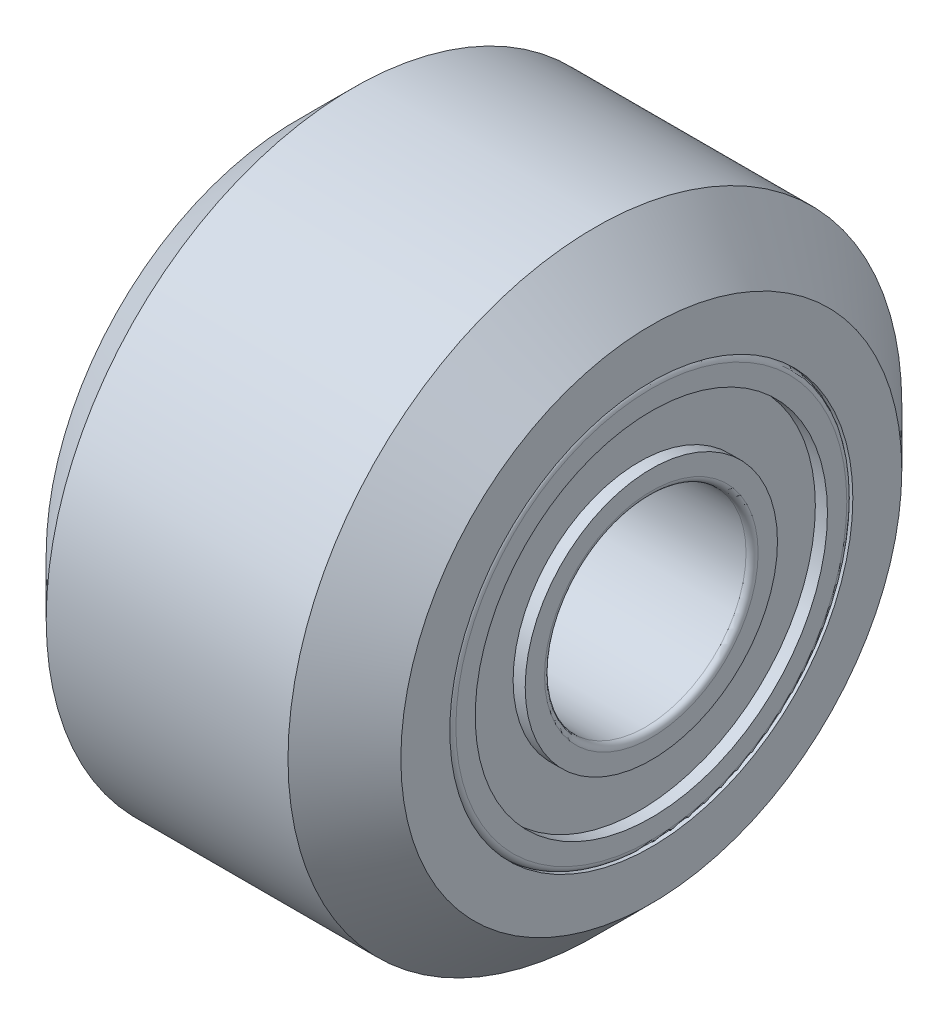
ISO-10303-21;
HEADER;
FILE_DESCRIPTION(('STEP AP214'),'2;1');
FILE_NAME('part.step','',(''),(''),'','','');
FILE_SCHEMA(('AUTOMOTIVE_DESIGN { 1 0 10303 214 1 1 1 1 }'));
ENDSEC;
DATA;
#1=APPLICATION_CONTEXT('core data for automotive mechanical design processes');
#2=APPLICATION_PROTOCOL_DEFINITION('international standard','automotive_design',2000,#1);
#3=PRODUCT_CONTEXT('',#1,'mechanical');
#4=PRODUCT('Part','Part','',(#3));
#5=PRODUCT_RELATED_PRODUCT_CATEGORY('part','',(#4));
#6=PRODUCT_DEFINITION_FORMATION('','',#4);
#7=PRODUCT_DEFINITION_CONTEXT('part definition',#1,'design');
#8=PRODUCT_DEFINITION('design','',#6,#7);
#9=PRODUCT_DEFINITION_SHAPE('','',#8);
#10=(LENGTH_UNIT() NAMED_UNIT(*) SI_UNIT(.MILLI.,.METRE.));
#11=(NAMED_UNIT(*) PLANE_ANGLE_UNIT() SI_UNIT($,.RADIAN.));
#12=(NAMED_UNIT(*) SI_UNIT($,.STERADIAN.) SOLID_ANGLE_UNIT());
#13=UNCERTAINTY_MEASURE_WITH_UNIT(LENGTH_MEASURE(1.E-05),#10,'distance_accuracy_value','');
#14=(GEOMETRIC_REPRESENTATION_CONTEXT(3) GLOBAL_UNCERTAINTY_ASSIGNED_CONTEXT((#13)) GLOBAL_UNIT_ASSIGNED_CONTEXT((#10,
#11,#12)) REPRESENTATION_CONTEXT('',''));
#15=CARTESIAN_POINT('',(0.,0.,0.));
#16=DIRECTION('',(0.,0.,1.));
#17=DIRECTION('',(1.,0.,0.));
#18=AXIS2_PLACEMENT_3D('',#15,#16,#17);
#19=CARTESIAN_POINT('',(3.7,0.,4.37));
#20=DIRECTION('',(1.,0.,0.));
#21=DIRECTION('',(0.,1.,0.));
#22=AXIS2_PLACEMENT_3D('',#19,#20,#21);
#23=PLANE('',#22);
#24=CARTESIAN_POINT('',(3.7,0.,0.));
#25=DIRECTION('',(-1.,0.,0.));
#26=DIRECTION('',(0.,0.,1.));
#27=AXIS2_PLACEMENT_3D('',#24,#25,#26);
#28=CIRCLE('',#27,3.13);
#29=CARTESIAN_POINT('',(3.7,0.,-3.13));
#30=VERTEX_POINT('',#29);
#31=EDGE_CURVE('P0_E28',#30,#30,#28,.T.);
#32=ORIENTED_EDGE('',*,*,#31,.T.);
#33=EDGE_LOOP('',(#32));
#34=FACE_BOUND('',#33,.T.);
#35=CARTESIAN_POINT('',(3.7,0.,0.));
#36=DIRECTION('',(-1.,0.,0.));
#37=DIRECTION('',(0.,0.,1.));
#38=AXIS2_PLACEMENT_3D('',#35,#36,#37);
#39=CIRCLE('',#38,4.37);
#40=CARTESIAN_POINT('',(3.7,0.,-4.37));
#41=VERTEX_POINT('',#40);
#42=EDGE_CURVE('P0_E103',#41,#41,#39,.T.);
#43=ORIENTED_EDGE('',*,*,#42,.F.);
#44=EDGE_LOOP('',(#43));
#45=FACE_BOUND('',#44,.T.);
#46=ADVANCED_FACE('P0_F17',(#34,#45),#23,.T.);
#47=CARTESIAN_POINT('',(3.85,0.,0.));
#48=DIRECTION('',(-1.,0.,0.));
#49=DIRECTION('',(0.,0.,1.));
#50=AXIS2_PLACEMENT_3D('',#47,#48,#49);
#51=CYLINDRICAL_SURFACE('',#50,3.13);
#52=ORIENTED_EDGE('',*,*,#31,.F.);
#53=DIRECTION('',(1.,0.,0.));
#54=VECTOR('',#53,1.);
#55=CARTESIAN_POINT('',(3.85,0.,-3.13));
#56=LINE('',#55,#54);
#57=CARTESIAN_POINT('',(4.,0.,-3.13));
#58=VERTEX_POINT('',#57);
#59=EDGE_CURVE('P0_E11',#30,#58,#56,.T.);
#60=ORIENTED_EDGE('',*,*,#59,.T.);
#61=CARTESIAN_POINT('',(4.,0.,0.));
#62=DIRECTION('',(-1.,0.,0.));
#63=DIRECTION('',(0.,0.,1.));
#64=AXIS2_PLACEMENT_3D('',#61,#62,#63);
#65=CIRCLE('',#64,3.13);
#66=EDGE_CURVE('P0_E173',#58,#58,#65,.T.);
#67=ORIENTED_EDGE('',*,*,#66,.T.);
#68=ORIENTED_EDGE('',*,*,#59,.F.);
#69=EDGE_LOOP('',(#52,#60,#67,#68));
#70=FACE_BOUND('',#69,.T.);
#71=ADVANCED_FACE('P0_F19',(#70),#51,.T.);
#72=CARTESIAN_POINT('',(0.15,0.,0.));
#73=DIRECTION('',(-1.,0.,0.));
#74=DIRECTION('',(0.,0.,1.));
#75=AXIS2_PLACEMENT_3D('',#72,#73,#74);
#76=CYLINDRICAL_SURFACE('',#75,3.13);
#77=CARTESIAN_POINT('',(0.,0.,0.));
#78=DIRECTION('',(-1.,0.,0.));
#79=DIRECTION('',(0.,0.,1.));
#80=AXIS2_PLACEMENT_3D('',#77,#78,#79);
#81=CIRCLE('',#80,3.13);
#82=CARTESIAN_POINT('',(0.,0.,-3.13));
#83=VERTEX_POINT('',#82);
#84=EDGE_CURVE('P0_E95',#83,#83,#81,.T.);
#85=ORIENTED_EDGE('',*,*,#84,.F.);
#86=DIRECTION('',(1.,0.,0.));
#87=VECTOR('',#86,1.);
#88=CARTESIAN_POINT('',(0.15,0.,-3.13));
#89=LINE('',#88,#87);
#90=CARTESIAN_POINT('',(0.3,0.,-3.13));
#91=VERTEX_POINT('',#90);
#92=EDGE_CURVE('P0_E145',#83,#91,#89,.T.);
#93=ORIENTED_EDGE('',*,*,#92,.T.);
#94=CARTESIAN_POINT('',(0.3,0.,0.));
#95=DIRECTION('',(-1.,0.,0.));
#96=DIRECTION('',(0.,0.,1.));
#97=AXIS2_PLACEMENT_3D('',#94,#95,#96);
#98=CIRCLE('',#97,3.13);
#99=EDGE_CURVE('P0_E115',#91,#91,#98,.T.);
#100=ORIENTED_EDGE('',*,*,#99,.T.);
#101=ORIENTED_EDGE('',*,*,#92,.F.);
#102=EDGE_LOOP('',(#85,#93,#100,#101));
#103=FACE_BOUND('',#102,.T.);
#104=ADVANCED_FACE('P0_F403',(#103),#76,.T.);
#105=CARTESIAN_POINT('',(0.3,0.,3.13));
#106=DIRECTION('',(-1.,0.,0.));
#107=DIRECTION('',(0.,0.,1.));
#108=AXIS2_PLACEMENT_3D('',#105,#106,#107);
#109=PLANE('',#108);
#110=ORIENTED_EDGE('',*,*,#99,.F.);
#111=EDGE_LOOP('',(#110));
#112=FACE_BOUND('',#111,.T.);
#113=CARTESIAN_POINT('',(0.3,0.,0.));
#114=DIRECTION('',(-1.,0.,0.));
#115=DIRECTION('',(0.,0.,1.));
#116=AXIS2_PLACEMENT_3D('',#113,#114,#115);
#117=CIRCLE('',#116,4.37);
#118=CARTESIAN_POINT('',(0.3,0.,-4.37));
#119=VERTEX_POINT('',#118);
#120=EDGE_CURVE('P0_E111',#119,#119,#117,.T.);
#121=ORIENTED_EDGE('',*,*,#120,.T.);
#122=EDGE_LOOP('',(#121));
#123=FACE_BOUND('',#122,.T.);
#124=ADVANCED_FACE('P0_F393',(#112,#123),#109,.T.);
#125=CARTESIAN_POINT('',(0.15,0.,0.));
#126=DIRECTION('',(-1.,0.,0.));
#127=DIRECTION('',(0.,0.,1.));
#128=AXIS2_PLACEMENT_3D('',#125,#126,#127);
#129=CYLINDRICAL_SURFACE('',#128,4.37);
#130=CARTESIAN_POINT('',(0.,0.,0.));
#131=DIRECTION('',(-1.,0.,0.));
#132=DIRECTION('',(0.,0.,1.));
#133=AXIS2_PLACEMENT_3D('',#130,#131,#132);
#134=CIRCLE('',#133,4.37);
#135=CARTESIAN_POINT('',(0.,0.,-4.37));
#136=VERTEX_POINT('',#135);
#137=EDGE_CURVE('P0_E105',#136,#136,#134,.T.);
#138=ORIENTED_EDGE('',*,*,#137,.T.);
#139=DIRECTION('',(1.,0.,0.));
#140=VECTOR('',#139,1.);
#141=CARTESIAN_POINT('',(0.15,0.,-4.37));
#142=LINE('',#141,#140);
#143=EDGE_CURVE('P0_E116',#136,#119,#142,.T.);
#144=ORIENTED_EDGE('',*,*,#143,.T.);
#145=ORIENTED_EDGE('',*,*,#120,.F.);
#146=ORIENTED_EDGE('',*,*,#143,.F.);
#147=EDGE_LOOP('',(#138,#144,#145,#146));
#148=FACE_BOUND('',#147,.T.);
#149=ADVANCED_FACE('P0_F382',(#148),#129,.F.);
#150=CARTESIAN_POINT('',(3.85,0.,0.));
#151=DIRECTION('',(-1.,0.,0.));
#152=DIRECTION('',(0.,0.,1.));
#153=AXIS2_PLACEMENT_3D('',#150,#151,#152);
#154=CYLINDRICAL_SURFACE('',#153,4.37);
#155=ORIENTED_EDGE('',*,*,#42,.T.);
#156=DIRECTION('',(1.,0.,0.));
#157=VECTOR('',#156,1.);
#158=CARTESIAN_POINT('',(3.85,0.,-4.37));
#159=LINE('',#158,#157);
#160=CARTESIAN_POINT('',(4.,0.,-4.37));
#161=VERTEX_POINT('',#160);
#162=EDGE_CURVE('P0_E150',#41,#161,#159,.T.);
#163=ORIENTED_EDGE('',*,*,#162,.T.);
#164=CARTESIAN_POINT('',(4.,0.,0.));
#165=DIRECTION('',(-1.,0.,0.));
#166=DIRECTION('',(0.,0.,1.));
#167=AXIS2_PLACEMENT_3D('',#164,#165,#166);
#168=CIRCLE('',#167,4.37);
#169=EDGE_CURVE('P0_E127',#161,#161,#168,.T.);
#170=ORIENTED_EDGE('',*,*,#169,.F.);
#171=ORIENTED_EDGE('',*,*,#162,.F.);
#172=EDGE_LOOP('',(#155,#163,#170,#171));
#173=FACE_BOUND('',#172,.T.);
#174=ADVANCED_FACE('P0_F373',(#173),#154,.F.);
#175=CARTESIAN_POINT('',(0.,0.,2.5));
#176=DIRECTION('',(-1.,0.,0.));
#177=DIRECTION('',(0.,0.,1.));
#178=AXIS2_PLACEMENT_3D('',#175,#176,#177);
#179=PLANE('',#178);
#180=CARTESIAN_POINT('',(0.,0.,0.));
#181=DIRECTION('',(-1.,0.,0.));
#182=DIRECTION('',(0.,0.,-1.));
#183=AXIS2_PLACEMENT_3D('',#180,#181,#182);
#184=CIRCLE('',#183,2.65);
#185=CARTESIAN_POINT('',(0.,0.,-2.65));
#186=VERTEX_POINT('',#185);
#187=EDGE_CURVE('P0_E88',#186,#186,#184,.T.);
#188=ORIENTED_EDGE('',*,*,#187,.F.);
#189=EDGE_LOOP('',(#188));
#190=FACE_BOUND('',#189,.T.);
#191=ORIENTED_EDGE('',*,*,#84,.T.);
#192=EDGE_LOOP('',(#191));
#193=FACE_BOUND('',#192,.T.);
#194=ADVANCED_FACE('P0_F363',(#190,#193),#179,.T.);
#195=CARTESIAN_POINT('',(0.15,0.,0.));
#196=DIRECTION('',(-1.,0.,0.));
#197=DIRECTION('',(0.,0.,1.));
#198=AXIS2_PLACEMENT_3D('',#195,#196,#197);
#199=TOROIDAL_SURFACE('',#198,2.65,0.15);
#200=CARTESIAN_POINT('',(0.15,0.,0.));
#201=DIRECTION('',(1.,0.,0.));
#202=DIRECTION('',(0.,0.,-1.));
#203=AXIS2_PLACEMENT_3D('',#200,#201,#202);
#204=CIRCLE('',#203,2.5);
#205=CARTESIAN_POINT('',(0.15,0.,-2.5));
#206=VERTEX_POINT('',#205);
#207=EDGE_CURVE('P0_E152',#206,#206,#204,.T.);
#208=ORIENTED_EDGE('',*,*,#207,.T.);
#209=CARTESIAN_POINT('',(0.15,0.,-2.65));
#210=DIRECTION('',(0.,-1.,0.));
#211=DIRECTION('',(0.,0.,-1.));
#212=AXIS2_PLACEMENT_3D('',#209,#210,#211);
#213=CIRCLE('',#212,0.15);
#214=EDGE_CURVE('P0_E91',#206,#186,#213,.T.);
#215=ORIENTED_EDGE('',*,*,#214,.T.);
#216=ORIENTED_EDGE('',*,*,#187,.T.);
#217=ORIENTED_EDGE('',*,*,#214,.F.);
#218=EDGE_LOOP('',(#208,#215,#216,#217));
#219=FACE_BOUND('',#218,.T.);
#220=ADVANCED_FACE('P0_F90',(#219),#199,.T.);
#221=CARTESIAN_POINT('',(0.,0.,4.37));
#222=DIRECTION('',(-1.,0.,0.));
#223=DIRECTION('',(0.,0.,1.));
#224=AXIS2_PLACEMENT_3D('',#221,#222,#223);
#225=PLANE('',#224);
#226=ORIENTED_EDGE('',*,*,#137,.F.);
#227=EDGE_LOOP('',(#226));
#228=FACE_BOUND('',#227,.T.);
#229=CARTESIAN_POINT('',(0.,0.,0.));
#230=DIRECTION('',(1.,0.,0.));
#231=DIRECTION('',(0.,0.,-1.));
#232=AXIS2_PLACEMENT_3D('',#229,#230,#231);
#233=CIRCLE('',#232,4.85);
#234=CARTESIAN_POINT('',(0.,0.,-4.85));
#235=VERTEX_POINT('',#234);
#236=EDGE_CURVE('P0_E131',#235,#235,#233,.T.);
#237=ORIENTED_EDGE('',*,*,#236,.F.);
#238=EDGE_LOOP('',(#237));
#239=FACE_BOUND('',#238,.T.);
#240=ADVANCED_FACE('P0_F343',(#228,#239),#225,.T.);
#241=CARTESIAN_POINT('',(0.15,0.,0.));
#242=DIRECTION('',(-1.,0.,0.));
#243=DIRECTION('',(0.,0.,1.));
#244=AXIS2_PLACEMENT_3D('',#241,#242,#243);
#245=TOROIDAL_SURFACE('',#244,4.85,0.15);
#246=ORIENTED_EDGE('',*,*,#236,.T.);
#247=CARTESIAN_POINT('',(0.15,0.,-4.85));
#248=DIRECTION('',(0.,-1.,0.));
#249=DIRECTION('',(0.,0.,-1.));
#250=AXIS2_PLACEMENT_3D('',#247,#248,#249);
#251=CIRCLE('',#250,0.15);
#252=CARTESIAN_POINT('',(0.15,0.,-5.));
#253=VERTEX_POINT('',#252);
#254=EDGE_CURVE('P0_E126',#235,#253,#251,.T.);
#255=ORIENTED_EDGE('',*,*,#254,.T.);
#256=CARTESIAN_POINT('',(0.15,0.,0.));
#257=DIRECTION('',(-1.,0.,0.));
#258=DIRECTION('',(0.,0.,-1.));
#259=AXIS2_PLACEMENT_3D('',#256,#257,#258);
#260=CIRCLE('',#259,5.);
#261=EDGE_CURVE('P0_E136',#253,#253,#260,.T.);
#262=ORIENTED_EDGE('',*,*,#261,.T.);
#263=ORIENTED_EDGE('',*,*,#254,.F.);
#264=EDGE_LOOP('',(#246,#255,#262,#263));
#265=FACE_BOUND('',#264,.T.);
#266=ADVANCED_FACE('P0_F331',(#265),#245,.T.);
#267=CARTESIAN_POINT('',(4.,0.,5.));
#268=DIRECTION('',(1.,0.,0.));
#269=DIRECTION('',(0.,1.,0.));
#270=AXIS2_PLACEMENT_3D('',#267,#268,#269);
#271=PLANE('',#270);
#272=ORIENTED_EDGE('',*,*,#169,.T.);
#273=EDGE_LOOP('',(#272));
#274=FACE_BOUND('',#273,.T.);
#275=CARTESIAN_POINT('',(4.,0.,0.));
#276=DIRECTION('',(-1.,0.,0.));
#277=DIRECTION('',(0.,0.,-1.));
#278=AXIS2_PLACEMENT_3D('',#275,#276,#277);
#279=CIRCLE('',#278,4.85);
#280=CARTESIAN_POINT('',(4.,0.,-4.85));
#281=VERTEX_POINT('',#280);
#282=EDGE_CURVE('P0_E121',#281,#281,#279,.T.);
#283=ORIENTED_EDGE('',*,*,#282,.F.);
#284=EDGE_LOOP('',(#283));
#285=FACE_BOUND('',#284,.T.);
#286=ADVANCED_FACE('P0_F320',(#274,#285),#271,.T.);
#287=CARTESIAN_POINT('',(2.,0.,0.));
#288=DIRECTION('',(-1.,0.,0.));
#289=DIRECTION('',(0.,0.,1.));
#290=AXIS2_PLACEMENT_3D('',#287,#288,#289);
#291=CYLINDRICAL_SURFACE('',#290,5.);
#292=ORIENTED_EDGE('',*,*,#261,.F.);
#293=DIRECTION('',(1.,0.,0.));
#294=VECTOR('',#293,1.);
#295=CARTESIAN_POINT('',(2.,0.,-5.));
#296=LINE('',#295,#294);
#297=CARTESIAN_POINT('',(3.85,0.,-5.));
#298=VERTEX_POINT('',#297);
#299=EDGE_CURVE('P0_E132',#253,#298,#296,.T.);
#300=ORIENTED_EDGE('',*,*,#299,.T.);
#301=CARTESIAN_POINT('',(3.85,0.,0.));
#302=DIRECTION('',(1.,0.,0.));
#303=DIRECTION('',(0.,0.,-1.));
#304=AXIS2_PLACEMENT_3D('',#301,#302,#303);
#305=CIRCLE('',#304,5.);
#306=EDGE_CURVE('P0_E122',#298,#298,#305,.T.);
#307=ORIENTED_EDGE('',*,*,#306,.F.);
#308=ORIENTED_EDGE('',*,*,#299,.F.);
#309=EDGE_LOOP('',(#292,#300,#307,#308));
#310=FACE_BOUND('',#309,.T.);
#311=ADVANCED_FACE('P0_F309',(#310),#291,.T.);
#312=CARTESIAN_POINT('',(3.85,0.,0.));
#313=DIRECTION('',(-1.,0.,0.));
#314=DIRECTION('',(0.,0.,1.));
#315=AXIS2_PLACEMENT_3D('',#312,#313,#314);
#316=TOROIDAL_SURFACE('',#315,4.85,0.15);
#317=ORIENTED_EDGE('',*,*,#306,.T.);
#318=CARTESIAN_POINT('',(3.85,0.,-4.85));
#319=DIRECTION('',(0.,-1.,0.));
#320=DIRECTION('',(0.,0.,-1.));
#321=AXIS2_PLACEMENT_3D('',#318,#319,#320);
#322=CIRCLE('',#321,0.15);
#323=EDGE_CURVE('P0_E117',#298,#281,#322,.T.);
#324=ORIENTED_EDGE('',*,*,#323,.T.);
#325=ORIENTED_EDGE('',*,*,#282,.T.);
#326=ORIENTED_EDGE('',*,*,#323,.F.);
#327=EDGE_LOOP('',(#317,#324,#325,#326));
#328=FACE_BOUND('',#327,.T.);
#329=ADVANCED_FACE('P0_F297',(#328),#316,.T.);
#330=CARTESIAN_POINT('',(4.,0.,3.13));
#331=DIRECTION('',(1.,0.,0.));
#332=DIRECTION('',(0.,1.,0.));
#333=AXIS2_PLACEMENT_3D('',#330,#331,#332);
#334=PLANE('',#333);
#335=CARTESIAN_POINT('',(4.,0.,0.));
#336=DIRECTION('',(1.,0.,0.));
#337=DIRECTION('',(0.,0.,-1.));
#338=AXIS2_PLACEMENT_3D('',#335,#336,#337);
#339=CIRCLE('',#338,2.65);
#340=CARTESIAN_POINT('',(4.,0.,-2.65));
#341=VERTEX_POINT('',#340);
#342=EDGE_CURVE('P0_E109',#341,#341,#339,.T.);
#343=ORIENTED_EDGE('',*,*,#342,.F.);
#344=EDGE_LOOP('',(#343));
#345=FACE_BOUND('',#344,.T.);
#346=ORIENTED_EDGE('',*,*,#66,.F.);
#347=EDGE_LOOP('',(#346));
#348=FACE_BOUND('',#347,.T.);
#349=ADVANCED_FACE('P0_F287',(#345,#348),#334,.T.);
#350=CARTESIAN_POINT('',(2.,0.,0.));
#351=DIRECTION('',(-1.,0.,0.));
#352=DIRECTION('',(0.,0.,1.));
#353=AXIS2_PLACEMENT_3D('',#350,#351,#352);
#354=CYLINDRICAL_SURFACE('',#353,2.5);
#355=ORIENTED_EDGE('',*,*,#207,.F.);
#356=DIRECTION('',(1.,0.,0.));
#357=VECTOR('',#356,1.);
#358=CARTESIAN_POINT('',(2.,0.,-2.5));
#359=LINE('',#358,#357);
#360=CARTESIAN_POINT('',(3.85,0.,-2.5));
#361=VERTEX_POINT('',#360);
#362=EDGE_CURVE('P0_E155',#206,#361,#359,.T.);
#363=ORIENTED_EDGE('',*,*,#362,.T.);
#364=CARTESIAN_POINT('',(3.85,0.,0.));
#365=DIRECTION('',(-1.,0.,0.));
#366=DIRECTION('',(0.,0.,-1.));
#367=AXIS2_PLACEMENT_3D('',#364,#365,#366);
#368=CIRCLE('',#367,2.5);
#369=EDGE_CURVE('P0_E21',#361,#361,#368,.T.);
#370=ORIENTED_EDGE('',*,*,#369,.F.);
#371=ORIENTED_EDGE('',*,*,#362,.F.);
#372=EDGE_LOOP('',(#355,#363,#370,#371));
#373=FACE_BOUND('',#372,.T.);
#374=ADVANCED_FACE('P0_F187',(#373),#354,.F.);
#375=CARTESIAN_POINT('',(3.85,0.,0.));
#376=DIRECTION('',(-1.,0.,0.));
#377=DIRECTION('',(0.,0.,1.));
#378=AXIS2_PLACEMENT_3D('',#375,#376,#377);
#379=TOROIDAL_SURFACE('',#378,2.65,0.15);
#380=ORIENTED_EDGE('',*,*,#342,.T.);
#381=CARTESIAN_POINT('',(3.85,0.,-2.65));
#382=DIRECTION('',(0.,-1.,0.));
#383=DIRECTION('',(0.,0.,-1.));
#384=AXIS2_PLACEMENT_3D('',#381,#382,#383);
#385=CIRCLE('',#384,0.15);
#386=EDGE_CURVE('P0_E156',#341,#361,#385,.T.);
#387=ORIENTED_EDGE('',*,*,#386,.T.);
#388=ORIENTED_EDGE('',*,*,#369,.T.);
#389=ORIENTED_EDGE('',*,*,#386,.F.);
#390=EDGE_LOOP('',(#380,#387,#388,#389));
#391=FACE_BOUND('',#390,.T.);
#392=ADVANCED_FACE('P0_F190',(#391),#379,.T.);
#393=CLOSED_SHELL('',(#46,#71,#104,#124,#149,#174,#194,#220,#240,#266,#286,#311,#329,#349,#374,#392));
#394=MANIFOLD_SOLID_BREP('P0_B1',#393);
#395=CARTESIAN_POINT('',(8.499999642372,0.,4.37));
#396=DIRECTION('',(1.,0.,0.));
#397=DIRECTION('',(0.,1.,0.));
#398=AXIS2_PLACEMENT_3D('',#395,#396,#397);
#399=PLANE('',#398);
#400=CARTESIAN_POINT('',(8.499999642372,0.,0.));
#401=DIRECTION('',(-1.,0.,0.));
#402=DIRECTION('',(0.,0.,1.));
#403=AXIS2_PLACEMENT_3D('',#400,#401,#402);
#404=CIRCLE('',#403,3.13);
#405=CARTESIAN_POINT('',(8.499999642372,0.,-3.13));
#406=VERTEX_POINT('',#405);
#407=EDGE_CURVE('P1_E28',#406,#406,#404,.T.);
#408=ORIENTED_EDGE('',*,*,#407,.T.);
#409=EDGE_LOOP('',(#408));
#410=FACE_BOUND('',#409,.T.);
#411=CARTESIAN_POINT('',(8.499999642372,0.,0.));
#412=DIRECTION('',(-1.,0.,0.));
#413=DIRECTION('',(0.,0.,1.));
#414=AXIS2_PLACEMENT_3D('',#411,#412,#413);
#415=CIRCLE('',#414,4.37);
#416=CARTESIAN_POINT('',(8.499999642372,0.,-4.37));
#417=VERTEX_POINT('',#416);
#418=EDGE_CURVE('P1_E103',#417,#417,#415,.T.);
#419=ORIENTED_EDGE('',*,*,#418,.F.);
#420=EDGE_LOOP('',(#419));
#421=FACE_BOUND('',#420,.T.);
#422=ADVANCED_FACE('P1_F17',(#410,#421),#399,.T.);
#423=CARTESIAN_POINT('',(8.649999642372,0.,0.));
#424=DIRECTION('',(-1.,0.,0.));
#425=DIRECTION('',(0.,0.,1.));
#426=AXIS2_PLACEMENT_3D('',#423,#424,#425);
#427=CYLINDRICAL_SURFACE('',#426,3.13);
#428=ORIENTED_EDGE('',*,*,#407,.F.);
#429=DIRECTION('',(1.,0.,0.));
#430=VECTOR('',#429,1.);
#431=CARTESIAN_POINT('',(8.649999642372,0.,-3.13));
#432=LINE('',#431,#430);
#433=CARTESIAN_POINT('',(8.799999642372,0.,-3.13));
#434=VERTEX_POINT('',#433);
#435=EDGE_CURVE('P1_E11',#406,#434,#432,.T.);
#436=ORIENTED_EDGE('',*,*,#435,.T.);
#437=CARTESIAN_POINT('',(8.799999642372,0.,0.));
#438=DIRECTION('',(-1.,0.,0.));
#439=DIRECTION('',(0.,0.,1.));
#440=AXIS2_PLACEMENT_3D('',#437,#438,#439);
#441=CIRCLE('',#440,3.13);
#442=EDGE_CURVE('P1_E173',#434,#434,#441,.T.);
#443=ORIENTED_EDGE('',*,*,#442,.T.);
#444=ORIENTED_EDGE('',*,*,#435,.F.);
#445=EDGE_LOOP('',(#428,#436,#443,#444));
#446=FACE_BOUND('',#445,.T.);
#447=ADVANCED_FACE('P1_F19',(#446),#427,.T.);
#448=CARTESIAN_POINT('',(4.949999642372,0.,0.));
#449=DIRECTION('',(-1.,0.,0.));
#450=DIRECTION('',(0.,0.,1.));
#451=AXIS2_PLACEMENT_3D('',#448,#449,#450);
#452=CYLINDRICAL_SURFACE('',#451,3.13);
#453=CARTESIAN_POINT('',(4.799999642372,0.,0.));
#454=DIRECTION('',(-1.,0.,0.));
#455=DIRECTION('',(0.,0.,1.));
#456=AXIS2_PLACEMENT_3D('',#453,#454,#455);
#457=CIRCLE('',#456,3.13);
#458=CARTESIAN_POINT('',(4.799999642372,0.,-3.13));
#459=VERTEX_POINT('',#458);
#460=EDGE_CURVE('P1_E95',#459,#459,#457,.T.);
#461=ORIENTED_EDGE('',*,*,#460,.F.);
#462=DIRECTION('',(1.,0.,0.));
#463=VECTOR('',#462,1.);
#464=CARTESIAN_POINT('',(4.949999642372,0.,-3.13));
#465=LINE('',#464,#463);
#466=CARTESIAN_POINT('',(5.099999642372,0.,-3.13));
#467=VERTEX_POINT('',#466);
#468=EDGE_CURVE('P1_E145',#459,#467,#465,.T.);
#469=ORIENTED_EDGE('',*,*,#468,.T.);
#470=CARTESIAN_POINT('',(5.099999642372,0.,0.));
#471=DIRECTION('',(-1.,0.,0.));
#472=DIRECTION('',(0.,0.,1.));
#473=AXIS2_PLACEMENT_3D('',#470,#471,#472);
#474=CIRCLE('',#473,3.13);
#475=EDGE_CURVE('P1_E115',#467,#467,#474,.T.);
#476=ORIENTED_EDGE('',*,*,#475,.T.);
#477=ORIENTED_EDGE('',*,*,#468,.F.);
#478=EDGE_LOOP('',(#461,#469,#476,#477));
#479=FACE_BOUND('',#478,.T.);
#480=ADVANCED_FACE('P1_F403',(#479),#452,.T.);
#481=CARTESIAN_POINT('',(5.099999642372,0.,3.13));
#482=DIRECTION('',(-1.,0.,0.));
#483=DIRECTION('',(0.,0.,1.));
#484=AXIS2_PLACEMENT_3D('',#481,#482,#483);
#485=PLANE('',#484);
#486=ORIENTED_EDGE('',*,*,#475,.F.);
#487=EDGE_LOOP('',(#486));
#488=FACE_BOUND('',#487,.T.);
#489=CARTESIAN_POINT('',(5.099999642372,0.,0.));
#490=DIRECTION('',(-1.,0.,0.));
#491=DIRECTION('',(0.,0.,1.));
#492=AXIS2_PLACEMENT_3D('',#489,#490,#491);
#493=CIRCLE('',#492,4.37);
#494=CARTESIAN_POINT('',(5.099999642372,0.,-4.37));
#495=VERTEX_POINT('',#494);
#496=EDGE_CURVE('P1_E111',#495,#495,#493,.T.);
#497=ORIENTED_EDGE('',*,*,#496,.T.);
#498=EDGE_LOOP('',(#497));
#499=FACE_BOUND('',#498,.T.);
#500=ADVANCED_FACE('P1_F393',(#488,#499),#485,.T.);
#501=CARTESIAN_POINT('',(4.949999642372,0.,0.));
#502=DIRECTION('',(-1.,0.,0.));
#503=DIRECTION('',(0.,0.,1.));
#504=AXIS2_PLACEMENT_3D('',#501,#502,#503);
#505=CYLINDRICAL_SURFACE('',#504,4.37);
#506=CARTESIAN_POINT('',(4.799999642372,0.,0.));
#507=DIRECTION('',(-1.,0.,0.));
#508=DIRECTION('',(0.,0.,1.));
#509=AXIS2_PLACEMENT_3D('',#506,#507,#508);
#510=CIRCLE('',#509,4.37);
#511=CARTESIAN_POINT('',(4.799999642372,0.,-4.37));
#512=VERTEX_POINT('',#511);
#513=EDGE_CURVE('P1_E105',#512,#512,#510,.T.);
#514=ORIENTED_EDGE('',*,*,#513,.T.);
#515=DIRECTION('',(1.,0.,0.));
#516=VECTOR('',#515,1.);
#517=CARTESIAN_POINT('',(4.949999642372,0.,-4.37));
#518=LINE('',#517,#516);
#519=EDGE_CURVE('P1_E116',#512,#495,#518,.T.);
#520=ORIENTED_EDGE('',*,*,#519,.T.);
#521=ORIENTED_EDGE('',*,*,#496,.F.);
#522=ORIENTED_EDGE('',*,*,#519,.F.);
#523=EDGE_LOOP('',(#514,#520,#521,#522));
#524=FACE_BOUND('',#523,.T.);
#525=ADVANCED_FACE('P1_F382',(#524),#505,.F.);
#526=CARTESIAN_POINT('',(8.649999642372,0.,0.));
#527=DIRECTION('',(-1.,0.,0.));
#528=DIRECTION('',(0.,0.,1.));
#529=AXIS2_PLACEMENT_3D('',#526,#527,#528);
#530=CYLINDRICAL_SURFACE('',#529,4.37);
#531=ORIENTED_EDGE('',*,*,#418,.T.);
#532=DIRECTION('',(1.,0.,0.));
#533=VECTOR('',#532,1.);
#534=CARTESIAN_POINT('',(8.649999642372,0.,-4.37));
#535=LINE('',#534,#533);
#536=CARTESIAN_POINT('',(8.799999642372,0.,-4.37));
#537=VERTEX_POINT('',#536);
#538=EDGE_CURVE('P1_E150',#417,#537,#535,.T.);
#539=ORIENTED_EDGE('',*,*,#538,.T.);
#540=CARTESIAN_POINT('',(8.799999642372,0.,0.));
#541=DIRECTION('',(-1.,0.,0.));
#542=DIRECTION('',(0.,0.,1.));
#543=AXIS2_PLACEMENT_3D('',#540,#541,#542);
#544=CIRCLE('',#543,4.37);
#545=EDGE_CURVE('P1_E127',#537,#537,#544,.T.);
#546=ORIENTED_EDGE('',*,*,#545,.F.);
#547=ORIENTED_EDGE('',*,*,#538,.F.);
#548=EDGE_LOOP('',(#531,#539,#546,#547));
#549=FACE_BOUND('',#548,.T.);
#550=ADVANCED_FACE('P1_F373',(#549),#530,.F.);
#551=CARTESIAN_POINT('',(4.799999642372,0.,2.5));
#552=DIRECTION('',(-1.,0.,0.));
#553=DIRECTION('',(0.,0.,1.));
#554=AXIS2_PLACEMENT_3D('',#551,#552,#553);
#555=PLANE('',#554);
#556=CARTESIAN_POINT('',(4.799999642372,0.,0.));
#557=DIRECTION('',(-1.,0.,0.));
#558=DIRECTION('',(0.,0.,-1.));
#559=AXIS2_PLACEMENT_3D('',#556,#557,#558);
#560=CIRCLE('',#559,2.65);
#561=CARTESIAN_POINT('',(4.799999642372,0.,-2.65));
#562=VERTEX_POINT('',#561);
#563=EDGE_CURVE('P1_E88',#562,#562,#560,.T.);
#564=ORIENTED_EDGE('',*,*,#563,.F.);
#565=EDGE_LOOP('',(#564));
#566=FACE_BOUND('',#565,.T.);
#567=ORIENTED_EDGE('',*,*,#460,.T.);
#568=EDGE_LOOP('',(#567));
#569=FACE_BOUND('',#568,.T.);
#570=ADVANCED_FACE('P1_F363',(#566,#569),#555,.T.);
#571=CARTESIAN_POINT('',(4.949999642372,0.,0.));
#572=DIRECTION('',(-1.,0.,0.));
#573=DIRECTION('',(0.,0.,1.));
#574=AXIS2_PLACEMENT_3D('',#571,#572,#573);
#575=TOROIDAL_SURFACE('',#574,2.65,0.15);
#576=CARTESIAN_POINT('',(4.949999642372,0.,0.));
#577=DIRECTION('',(1.,0.,0.));
#578=DIRECTION('',(0.,0.,-1.));
#579=AXIS2_PLACEMENT_3D('',#576,#577,#578);
#580=CIRCLE('',#579,2.5);
#581=CARTESIAN_POINT('',(4.949999642372,0.,-2.5));
#582=VERTEX_POINT('',#581);
#583=EDGE_CURVE('P1_E152',#582,#582,#580,.T.);
#584=ORIENTED_EDGE('',*,*,#583,.T.);
#585=CARTESIAN_POINT('',(4.949999642372,0.,-2.65));
#586=DIRECTION('',(0.,-1.,0.));
#587=DIRECTION('',(0.,0.,-1.));
#588=AXIS2_PLACEMENT_3D('',#585,#586,#587);
#589=CIRCLE('',#588,0.15);
#590=EDGE_CURVE('P1_E91',#582,#562,#589,.T.);
#591=ORIENTED_EDGE('',*,*,#590,.T.);
#592=ORIENTED_EDGE('',*,*,#563,.T.);
#593=ORIENTED_EDGE('',*,*,#590,.F.);
#594=EDGE_LOOP('',(#584,#591,#592,#593));
#595=FACE_BOUND('',#594,.T.);
#596=ADVANCED_FACE('P1_F90',(#595),#575,.T.);
#597=CARTESIAN_POINT('',(4.799999642372,0.,4.37));
#598=DIRECTION('',(-1.,0.,0.));
#599=DIRECTION('',(0.,0.,1.));
#600=AXIS2_PLACEMENT_3D('',#597,#598,#599);
#601=PLANE('',#600);
#602=ORIENTED_EDGE('',*,*,#513,.F.);
#603=EDGE_LOOP('',(#602));
#604=FACE_BOUND('',#603,.T.);
#605=CARTESIAN_POINT('',(4.799999642372,0.,0.));
#606=DIRECTION('',(1.,0.,0.));
#607=DIRECTION('',(0.,0.,-1.));
#608=AXIS2_PLACEMENT_3D('',#605,#606,#607);
#609=CIRCLE('',#608,4.85);
#610=CARTESIAN_POINT('',(4.799999642372,0.,-4.85));
#611=VERTEX_POINT('',#610);
#612=EDGE_CURVE('P1_E131',#611,#611,#609,.T.);
#613=ORIENTED_EDGE('',*,*,#612,.F.);
#614=EDGE_LOOP('',(#613));
#615=FACE_BOUND('',#614,.T.);
#616=ADVANCED_FACE('P1_F343',(#604,#615),#601,.T.);
#617=CARTESIAN_POINT('',(4.949999642372,0.,0.));
#618=DIRECTION('',(-1.,0.,0.));
#619=DIRECTION('',(0.,0.,1.));
#620=AXIS2_PLACEMENT_3D('',#617,#618,#619);
#621=TOROIDAL_SURFACE('',#620,4.85,0.15);
#622=ORIENTED_EDGE('',*,*,#612,.T.);
#623=CARTESIAN_POINT('',(4.949999642372,0.,-4.85));
#624=DIRECTION('',(0.,-1.,0.));
#625=DIRECTION('',(0.,0.,-1.));
#626=AXIS2_PLACEMENT_3D('',#623,#624,#625);
#627=CIRCLE('',#626,0.15);
#628=CARTESIAN_POINT('',(4.949999642372,0.,-5.));
#629=VERTEX_POINT('',#628);
#630=EDGE_CURVE('P1_E126',#611,#629,#627,.T.);
#631=ORIENTED_EDGE('',*,*,#630,.T.);
#632=CARTESIAN_POINT('',(4.949999642372,0.,0.));
#633=DIRECTION('',(-1.,0.,0.));
#634=DIRECTION('',(0.,0.,-1.));
#635=AXIS2_PLACEMENT_3D('',#632,#633,#634);
#636=CIRCLE('',#635,5.);
#637=EDGE_CURVE('P1_E136',#629,#629,#636,.T.);
#638=ORIENTED_EDGE('',*,*,#637,.T.);
#639=ORIENTED_EDGE('',*,*,#630,.F.);
#640=EDGE_LOOP('',(#622,#631,#638,#639));
#641=FACE_BOUND('',#640,.T.);
#642=ADVANCED_FACE('P1_F331',(#641),#621,.T.);
#643=CARTESIAN_POINT('',(8.799999642372,0.,5.));
#644=DIRECTION('',(1.,0.,0.));
#645=DIRECTION('',(0.,1.,0.));
#646=AXIS2_PLACEMENT_3D('',#643,#644,#645);
#647=PLANE('',#646);
#648=ORIENTED_EDGE('',*,*,#545,.T.);
#649=EDGE_LOOP('',(#648));
#650=FACE_BOUND('',#649,.T.);
#651=CARTESIAN_POINT('',(8.799999642372,0.,0.));
#652=DIRECTION('',(-1.,0.,0.));
#653=DIRECTION('',(0.,0.,-1.));
#654=AXIS2_PLACEMENT_3D('',#651,#652,#653);
#655=CIRCLE('',#654,4.85);
#656=CARTESIAN_POINT('',(8.799999642372,0.,-4.85));
#657=VERTEX_POINT('',#656);
#658=EDGE_CURVE('P1_E121',#657,#657,#655,.T.);
#659=ORIENTED_EDGE('',*,*,#658,.F.);
#660=EDGE_LOOP('',(#659));
#661=FACE_BOUND('',#660,.T.);
#662=ADVANCED_FACE('P1_F320',(#650,#661),#647,.T.);
#663=CARTESIAN_POINT('',(6.799999642372,0.,0.));
#664=DIRECTION('',(-1.,0.,0.));
#665=DIRECTION('',(0.,0.,1.));
#666=AXIS2_PLACEMENT_3D('',#663,#664,#665);
#667=CYLINDRICAL_SURFACE('',#666,5.);
#668=ORIENTED_EDGE('',*,*,#637,.F.);
#669=DIRECTION('',(1.,0.,0.));
#670=VECTOR('',#669,1.);
#671=CARTESIAN_POINT('',(6.799999642372,0.,-5.));
#672=LINE('',#671,#670);
#673=CARTESIAN_POINT('',(8.649999642372,0.,-5.));
#674=VERTEX_POINT('',#673);
#675=EDGE_CURVE('P1_E132',#629,#674,#672,.T.);
#676=ORIENTED_EDGE('',*,*,#675,.T.);
#677=CARTESIAN_POINT('',(8.649999642372,0.,0.));
#678=DIRECTION('',(1.,0.,0.));
#679=DIRECTION('',(0.,0.,-1.));
#680=AXIS2_PLACEMENT_3D('',#677,#678,#679);
#681=CIRCLE('',#680,5.);
#682=EDGE_CURVE('P1_E122',#674,#674,#681,.T.);
#683=ORIENTED_EDGE('',*,*,#682,.F.);
#684=ORIENTED_EDGE('',*,*,#675,.F.);
#685=EDGE_LOOP('',(#668,#676,#683,#684));
#686=FACE_BOUND('',#685,.T.);
#687=ADVANCED_FACE('P1_F309',(#686),#667,.T.);
#688=CARTESIAN_POINT('',(8.649999642372,0.,0.));
#689=DIRECTION('',(-1.,0.,0.));
#690=DIRECTION('',(0.,0.,1.));
#691=AXIS2_PLACEMENT_3D('',#688,#689,#690);
#692=TOROIDAL_SURFACE('',#691,4.85,0.15);
#693=ORIENTED_EDGE('',*,*,#682,.T.);
#694=CARTESIAN_POINT('',(8.649999642372,0.,-4.85));
#695=DIRECTION('',(0.,-1.,0.));
#696=DIRECTION('',(0.,0.,-1.));
#697=AXIS2_PLACEMENT_3D('',#694,#695,#696);
#698=CIRCLE('',#697,0.15);
#699=EDGE_CURVE('P1_E117',#674,#657,#698,.T.);
#700=ORIENTED_EDGE('',*,*,#699,.T.);
#701=ORIENTED_EDGE('',*,*,#658,.T.);
#702=ORIENTED_EDGE('',*,*,#699,.F.);
#703=EDGE_LOOP('',(#693,#700,#701,#702));
#704=FACE_BOUND('',#703,.T.);
#705=ADVANCED_FACE('P1_F297',(#704),#692,.T.);
#706=CARTESIAN_POINT('',(8.799999642372,0.,3.13));
#707=DIRECTION('',(1.,0.,0.));
#708=DIRECTION('',(0.,1.,0.));
#709=AXIS2_PLACEMENT_3D('',#706,#707,#708);
#710=PLANE('',#709);
#711=CARTESIAN_POINT('',(8.799999642372,0.,0.));
#712=DIRECTION('',(1.,0.,0.));
#713=DIRECTION('',(0.,0.,-1.));
#714=AXIS2_PLACEMENT_3D('',#711,#712,#713);
#715=CIRCLE('',#714,2.65);
#716=CARTESIAN_POINT('',(8.799999642372,0.,-2.65));
#717=VERTEX_POINT('',#716);
#718=EDGE_CURVE('P1_E109',#717,#717,#715,.T.);
#719=ORIENTED_EDGE('',*,*,#718,.F.);
#720=EDGE_LOOP('',(#719));
#721=FACE_BOUND('',#720,.T.);
#722=ORIENTED_EDGE('',*,*,#442,.F.);
#723=EDGE_LOOP('',(#722));
#724=FACE_BOUND('',#723,.T.);
#725=ADVANCED_FACE('P1_F287',(#721,#724),#710,.T.);
#726=CARTESIAN_POINT('',(6.799999642372,0.,0.));
#727=DIRECTION('',(-1.,0.,0.));
#728=DIRECTION('',(0.,0.,1.));
#729=AXIS2_PLACEMENT_3D('',#726,#727,#728);
#730=CYLINDRICAL_SURFACE('',#729,2.5);
#731=ORIENTED_EDGE('',*,*,#583,.F.);
#732=DIRECTION('',(1.,0.,0.));
#733=VECTOR('',#732,1.);
#734=CARTESIAN_POINT('',(6.799999642372,0.,-2.5));
#735=LINE('',#734,#733);
#736=CARTESIAN_POINT('',(8.649999642372,0.,-2.5));
#737=VERTEX_POINT('',#736);
#738=EDGE_CURVE('P1_E155',#582,#737,#735,.T.);
#739=ORIENTED_EDGE('',*,*,#738,.T.);
#740=CARTESIAN_POINT('',(8.649999642372,0.,0.));
#741=DIRECTION('',(-1.,0.,0.));
#742=DIRECTION('',(0.,0.,-1.));
#743=AXIS2_PLACEMENT_3D('',#740,#741,#742);
#744=CIRCLE('',#743,2.5);
#745=EDGE_CURVE('P1_E21',#737,#737,#744,.T.);
#746=ORIENTED_EDGE('',*,*,#745,.F.);
#747=ORIENTED_EDGE('',*,*,#738,.F.);
#748=EDGE_LOOP('',(#731,#739,#746,#747));
#749=FACE_BOUND('',#748,.T.);
#750=ADVANCED_FACE('P1_F187',(#749),#730,.F.);
#751=CARTESIAN_POINT('',(8.649999642372,0.,0.));
#752=DIRECTION('',(-1.,0.,0.));
#753=DIRECTION('',(0.,0.,1.));
#754=AXIS2_PLACEMENT_3D('',#751,#752,#753);
#755=TOROIDAL_SURFACE('',#754,2.65,0.15);
#756=ORIENTED_EDGE('',*,*,#718,.T.);
#757=CARTESIAN_POINT('',(8.649999642372,0.,-2.65));
#758=DIRECTION('',(0.,-1.,0.));
#759=DIRECTION('',(0.,0.,-1.));
#760=AXIS2_PLACEMENT_3D('',#757,#758,#759);
#761=CIRCLE('',#760,0.15);
#762=EDGE_CURVE('P1_E156',#717,#737,#761,.T.);
#763=ORIENTED_EDGE('',*,*,#762,.T.);
#764=ORIENTED_EDGE('',*,*,#745,.T.);
#765=ORIENTED_EDGE('',*,*,#762,.F.);
#766=EDGE_LOOP('',(#756,#763,#764,#765));
#767=FACE_BOUND('',#766,.T.);
#768=ADVANCED_FACE('P1_F190',(#767),#755,.T.);
#769=CLOSED_SHELL('',(#422,#447,#480,#500,#525,#550,#570,#596,#616,#642,#662,#687,#705,#725,
#750,#768));
#770=MANIFOLD_SOLID_BREP('P1_B1',#769);
#771=CARTESIAN_POINT('',(4.8,0.,5.));
#772=DIRECTION('',(1.,0.,0.));
#773=DIRECTION('',(0.,1.,0.));
#774=AXIS2_PLACEMENT_3D('',#771,#772,#773);
#775=PLANE('',#774);
#776=CARTESIAN_POINT('',(4.8,0.,0.));
#777=DIRECTION('',(-1.,0.,0.));
#778=DIRECTION('',(0.,0.,1.));
#779=AXIS2_PLACEMENT_3D('',#776,#777,#778);
#780=CIRCLE('',#779,4.25);
#781=CARTESIAN_POINT('',(4.8,0.,-4.25));
#782=VERTEX_POINT('',#781);
#783=EDGE_CURVE('P2_E10',#782,#782,#780,.T.);
#784=ORIENTED_EDGE('',*,*,#783,.T.);
#785=EDGE_LOOP('',(#784));
#786=FACE_BOUND('',#785,.T.);
#787=CARTESIAN_POINT('',(4.8,0.,0.));
#788=DIRECTION('',(-1.,0.,0.));
#789=DIRECTION('',(0.,0.,1.));
#790=AXIS2_PLACEMENT_3D('',#787,#788,#789);
#791=CIRCLE('',#790,5.);
#792=CARTESIAN_POINT('',(4.8,0.,-5.));
#793=VERTEX_POINT('',#792);
#794=EDGE_CURVE('P2_E107',#793,#793,#791,.T.);
#795=ORIENTED_EDGE('',*,*,#794,.F.);
#796=EDGE_LOOP('',(#795));
#797=FACE_BOUND('',#796,.T.);
#798=ADVANCED_FACE('P2_F16',(#786,#797),#775,.T.);
#799=CARTESIAN_POINT('',(4.4,0.,0.));
#800=DIRECTION('',(-1.,0.,0.));
#801=DIRECTION('',(0.,0.,1.));
#802=AXIS2_PLACEMENT_3D('',#799,#800,#801);
#803=CYLINDRICAL_SURFACE('',#802,4.25);
#804=CARTESIAN_POINT('',(4.,0.,0.));
#805=DIRECTION('',(-1.,0.,0.));
#806=DIRECTION('',(0.,0.,1.));
#807=AXIS2_PLACEMENT_3D('',#804,#805,#806);
#808=CIRCLE('',#807,4.25);
#809=CARTESIAN_POINT('',(4.,0.,-4.25));
#810=VERTEX_POINT('',#809);
#811=EDGE_CURVE('P2_E142',#810,#810,#808,.T.);
#812=ORIENTED_EDGE('',*,*,#811,.T.);
#813=DIRECTION('',(1.,0.,0.));
#814=VECTOR('',#813,1.);
#815=CARTESIAN_POINT('',(4.4,0.,-4.25));
#816=LINE('',#815,#814);
#817=EDGE_CURVE('P2_E26',#810,#782,#816,.T.);
#818=ORIENTED_EDGE('',*,*,#817,.T.);
#819=ORIENTED_EDGE('',*,*,#783,.F.);
#820=ORIENTED_EDGE('',*,*,#817,.F.);
#821=EDGE_LOOP('',(#812,#818,#819,#820));
#822=FACE_BOUND('',#821,.T.);
#823=ADVANCED_FACE('P2_F192',(#822),#803,.F.);
#824=CARTESIAN_POINT('',(4.,0.,4.25));
#825=DIRECTION('',(-1.,0.,0.));
#826=DIRECTION('',(0.,0.,1.));
#827=AXIS2_PLACEMENT_3D('',#824,#825,#826);
#828=PLANE('',#827);
#829=ORIENTED_EDGE('',*,*,#811,.F.);
#830=EDGE_LOOP('',(#829));
#831=FACE_BOUND('',#830,.T.);
#832=CARTESIAN_POINT('',(4.,0.,0.));
#833=DIRECTION('',(-1.,0.,0.));
#834=DIRECTION('',(0.,0.,1.));
#835=AXIS2_PLACEMENT_3D('',#832,#833,#834);
#836=CIRCLE('',#835,5.);
#837=CARTESIAN_POINT('',(4.,0.,-5.));
#838=VERTEX_POINT('',#837);
#839=EDGE_CURVE('P2_E117',#838,#838,#836,.T.);
#840=ORIENTED_EDGE('',*,*,#839,.T.);
#841=EDGE_LOOP('',(#840));
#842=FACE_BOUND('',#841,.T.);
#843=ADVANCED_FACE('P2_F18',(#831,#842),#828,.T.);
#844=CARTESIAN_POINT('',(2.,0.,0.));
#845=DIRECTION('',(-1.,0.,0.));
#846=DIRECTION('',(0.,0.,1.));
#847=AXIS2_PLACEMENT_3D('',#844,#845,#846);
#848=CYLINDRICAL_SURFACE('',#847,5.);
#849=CARTESIAN_POINT('',(0.,0.,0.));
#850=DIRECTION('',(-1.,0.,0.));
#851=DIRECTION('',(0.,0.,1.));
#852=AXIS2_PLACEMENT_3D('',#849,#850,#851);
#853=CIRCLE('',#852,5.);
#854=CARTESIAN_POINT('',(0.,0.,-5.));
#855=VERTEX_POINT('',#854);
#856=EDGE_CURVE('P2_E119',#855,#855,#853,.T.);
#857=ORIENTED_EDGE('',*,*,#856,.T.);
#858=DIRECTION('',(1.,0.,0.));
#859=VECTOR('',#858,1.);
#860=CARTESIAN_POINT('',(2.,0.,-5.));
#861=LINE('',#860,#859);
#862=EDGE_CURVE('P2_E98',#855,#838,#861,.T.);
#863=ORIENTED_EDGE('',*,*,#862,.T.);
#864=ORIENTED_EDGE('',*,*,#839,.F.);
#865=ORIENTED_EDGE('',*,*,#862,.F.);
#866=EDGE_LOOP('',(#857,#863,#864,#865));
#867=FACE_BOUND('',#866,.T.);
#868=ADVANCED_FACE('P2_F189',(#867),#848,.F.);
#869=CARTESIAN_POINT('',(6.8,0.,0.));
#870=DIRECTION('',(-1.,0.,0.));
#871=DIRECTION('',(0.,0.,1.));
#872=AXIS2_PLACEMENT_3D('',#869,#870,#871);
#873=CYLINDRICAL_SURFACE('',#872,5.);
#874=ORIENTED_EDGE('',*,*,#794,.T.);
#875=DIRECTION('',(1.,0.,0.));
#876=VECTOR('',#875,1.);
#877=CARTESIAN_POINT('',(6.8,0.,-5.));
#878=LINE('',#877,#876);
#879=CARTESIAN_POINT('',(8.8,0.,-5.));
#880=VERTEX_POINT('',#879);
#881=EDGE_CURVE('P2_E104',#793,#880,#878,.T.);
#882=ORIENTED_EDGE('',*,*,#881,.T.);
#883=CARTESIAN_POINT('',(8.8,0.,0.));
#884=DIRECTION('',(-1.,0.,0.));
#885=DIRECTION('',(0.,0.,1.));
#886=AXIS2_PLACEMENT_3D('',#883,#884,#885);
#887=CIRCLE('',#886,5.);
#888=EDGE_CURVE('P2_E109',#880,#880,#887,.T.);
#889=ORIENTED_EDGE('',*,*,#888,.F.);
#890=ORIENTED_EDGE('',*,*,#881,.F.);
#891=EDGE_LOOP('',(#874,#882,#889,#890));
#892=FACE_BOUND('',#891,.T.);
#893=ADVANCED_FACE('P2_F105',(#892),#873,.F.);
#894=CARTESIAN_POINT('',(0.,0.,5.));
#895=DIRECTION('',(-1.,0.,0.));
#896=DIRECTION('',(0.,0.,1.));
#897=AXIS2_PLACEMENT_3D('',#894,#895,#896);
#898=PLANE('',#897);
#899=ORIENTED_EDGE('',*,*,#856,.F.);
#900=EDGE_LOOP('',(#899));
#901=FACE_BOUND('',#900,.T.);
#902=CARTESIAN_POINT('',(0.,0.,0.));
#903=DIRECTION('',(1.,0.,0.));
#904=DIRECTION('',(0.,0.,-1.));
#905=AXIS2_PLACEMENT_3D('',#902,#903,#904);
#906=CIRCLE('',#905,6.215);
#907=CARTESIAN_POINT('',(0.,0.,6.215));
#908=VERTEX_POINT('',#907);
#909=EDGE_CURVE('P2_E123',#908,#908,#906,.T.);
#910=ORIENTED_EDGE('',*,*,#909,.F.);
#911=EDGE_LOOP('',(#910));
#912=FACE_BOUND('',#911,.T.);
#913=ADVANCED_FACE('P2_F177',(#901,#912),#898,.T.);
#914=CARTESIAN_POINT('',(0.7,0.,0.));
#915=DIRECTION('',(1.,0.,0.));
#916=DIRECTION('',(0.,0.,-1.));
#917=AXIS2_PLACEMENT_3D('',#914,#915,#916);
#918=CONICAL_SURFACE('',#917,6.915,0.785398163397448);
#919=ORIENTED_EDGE('',*,*,#909,.T.);
#920=DIRECTION('',(0.707106781186547,0.,0.707106781186548));
#921=VECTOR('',#920,1.);
#922=CARTESIAN_POINT('',(0.7,0.,6.915));
#923=LINE('',#922,#921);
#924=CARTESIAN_POINT('',(1.4,0.,7.615));
#925=VERTEX_POINT('',#924);
#926=EDGE_CURVE('P2_E20',#908,#925,#923,.T.);
#927=ORIENTED_EDGE('',*,*,#926,.T.);
#928=CARTESIAN_POINT('',(1.4,0.,0.));
#929=DIRECTION('',(-1.,0.,0.));
#930=DIRECTION('',(0.,0.,-1.));
#931=AXIS2_PLACEMENT_3D('',#928,#929,#930);
#932=CIRCLE('',#931,7.615);
#933=CARTESIAN_POINT('',(1.4,0.,-7.615));
#934=VERTEX_POINT('',#933);
#935=EDGE_CURVE('P2_E137',#925,#934,#932,.T.);
#936=ORIENTED_EDGE('',*,*,#935,.T.);
#937=CARTESIAN_POINT('',(1.4,0.,0.));
#938=DIRECTION('',(-1.,0.,0.));
#939=DIRECTION('',(0.,0.,-1.));
#940=AXIS2_PLACEMENT_3D('',#937,#938,#939);
#941=CIRCLE('',#940,7.615);
#942=EDGE_CURVE('P2_E144',#934,#925,#941,.T.);
#943=ORIENTED_EDGE('',*,*,#942,.T.);
#944=ORIENTED_EDGE('',*,*,#926,.F.);
#945=EDGE_LOOP('',(#919,#927,#936,#943,#944));
#946=FACE_BOUND('',#945,.T.);
#947=ADVANCED_FACE('P2_F175',(#946),#918,.T.);
#948=CARTESIAN_POINT('',(8.8,0.,7.615));
#949=DIRECTION('',(1.,0.,0.));
#950=DIRECTION('',(0.,1.,0.));
#951=AXIS2_PLACEMENT_3D('',#948,#949,#950);
#952=PLANE('',#951);
#953=ORIENTED_EDGE('',*,*,#888,.T.);
#954=EDGE_LOOP('',(#953));
#955=FACE_BOUND('',#954,.T.);
#956=CARTESIAN_POINT('',(8.8,0.,0.));
#957=DIRECTION('',(-1.,0.,0.));
#958=DIRECTION('',(0.,0.,-1.));
#959=AXIS2_PLACEMENT_3D('',#956,#957,#958);
#960=CIRCLE('',#959,6.215);
#961=CARTESIAN_POINT('',(8.8,0.,6.215));
#962=VERTEX_POINT('',#961);
#963=EDGE_CURVE('P2_E132',#962,#962,#960,.T.);
#964=ORIENTED_EDGE('',*,*,#963,.F.);
#965=EDGE_LOOP('',(#964));
#966=FACE_BOUND('',#965,.T.);
#967=ADVANCED_FACE('P2_F187',(#955,#966),#952,.T.);
#968=CARTESIAN_POINT('',(4.4,0.,0.));
#969=DIRECTION('',(-1.,0.,0.));
#970=DIRECTION('',(0.,0.,1.));
#971=AXIS2_PLACEMENT_3D('',#968,#969,#970);
#972=CYLINDRICAL_SURFACE('',#971,7.615);
#973=ORIENTED_EDGE('',*,*,#935,.F.);
#974=ORIENTED_EDGE('',*,*,#942,.F.);
#975=DIRECTION('',(1.,0.,0.));
#976=VECTOR('',#975,1.);
#977=CARTESIAN_POINT('',(4.4,0.,-7.615));
#978=LINE('',#977,#976);
#979=CARTESIAN_POINT('',(7.4,0.,-7.615));
#980=VERTEX_POINT('',#979);
#981=EDGE_CURVE('P2_E87',#934,#980,#978,.T.);
#982=ORIENTED_EDGE('',*,*,#981,.T.);
#983=CARTESIAN_POINT('',(7.4,0.,0.));
#984=DIRECTION('',(1.,0.,0.));
#985=DIRECTION('',(0.,0.,-1.));
#986=AXIS2_PLACEMENT_3D('',#983,#984,#985);
#987=CIRCLE('',#986,7.615);
#988=CARTESIAN_POINT('',(7.4,0.,7.615));
#989=VERTEX_POINT('',#988);
#990=EDGE_CURVE('P2_E125',#989,#980,#987,.T.);
#991=ORIENTED_EDGE('',*,*,#990,.F.);
#992=CARTESIAN_POINT('',(7.4,0.,0.));
#993=DIRECTION('',(1.,0.,0.));
#994=DIRECTION('',(0.,0.,-1.));
#995=AXIS2_PLACEMENT_3D('',#992,#993,#994);
#996=CIRCLE('',#995,7.615);
#997=EDGE_CURVE('P2_E127',#980,#989,#996,.T.);
#998=ORIENTED_EDGE('',*,*,#997,.F.);
#999=ORIENTED_EDGE('',*,*,#981,.F.);
#1000=EDGE_LOOP('',(#973,#974,#982,#991,#998,#999));
#1001=FACE_BOUND('',#1000,.T.);
#1002=ADVANCED_FACE('P2_F201',(#1001),#972,.T.);
#1003=CARTESIAN_POINT('',(8.1,0.,0.));
#1004=DIRECTION('',(-1.,0.,0.));
#1005=DIRECTION('',(0.,0.,-1.));
#1006=AXIS2_PLACEMENT_3D('',#1003,#1004,#1005);
#1007=CONICAL_SURFACE('',#1006,6.915,0.785398163397448);
#1008=ORIENTED_EDGE('',*,*,#990,.T.);
#1009=ORIENTED_EDGE('',*,*,#997,.T.);
#1010=DIRECTION('',(0.707106781186548,0.,-0.707106781186547));
#1011=VECTOR('',#1010,1.);
#1012=CARTESIAN_POINT('',(8.1,0.,6.915));
#1013=LINE('',#1012,#1011);
#1014=EDGE_CURVE('P2_E76',#989,#962,#1013,.T.);
#1015=ORIENTED_EDGE('',*,*,#1014,.T.);
#1016=ORIENTED_EDGE('',*,*,#963,.T.);
#1017=ORIENTED_EDGE('',*,*,#1014,.F.);
#1018=EDGE_LOOP('',(#1008,#1009,#1015,#1016,#1017));
#1019=FACE_BOUND('',#1018,.T.);
#1020=ADVANCED_FACE('P2_F270',(#1019),#1007,.T.);
#1021=CLOSED_SHELL('',(#798,#823,#843,#868,#893,#913,#947,#967,#1002,#1020));
#1022=MANIFOLD_SOLID_BREP('P2_B1',#1021);
#1023=ADVANCED_BREP_SHAPE_REPRESENTATION('',(#18,#394,#770,#1022),#14);
#1024=SHAPE_DEFINITION_REPRESENTATION(#9,#1023);
ENDSEC;
END-ISO-10303-21;
